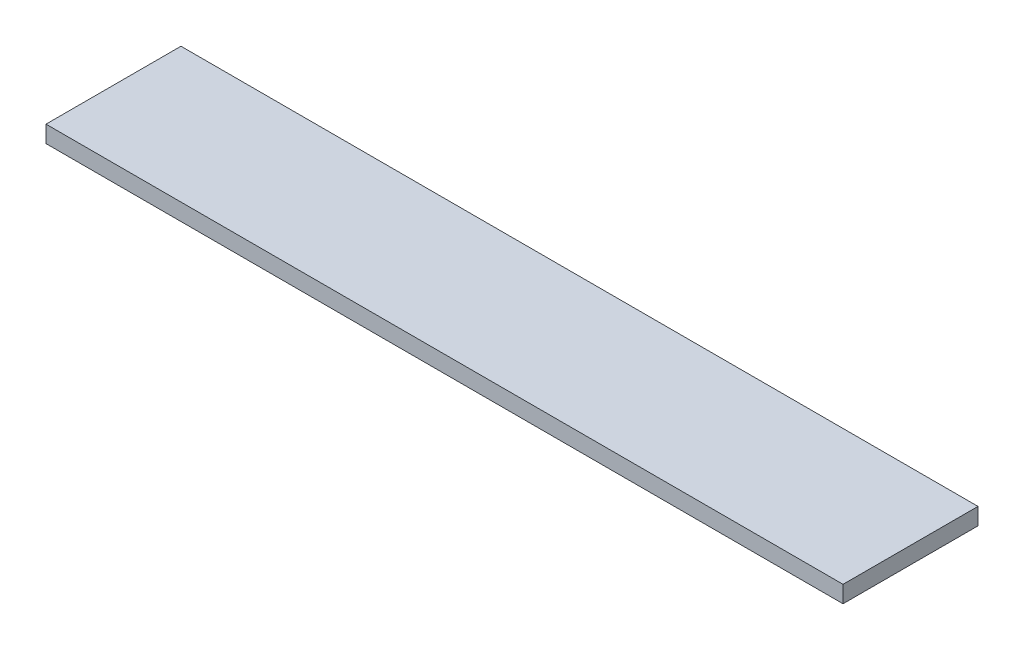
ISO-10303-21;
HEADER;
FILE_DESCRIPTION(('STEP AP214'),'2;1');
FILE_NAME('part.step','',(''),(''),'','','');
FILE_SCHEMA(('AUTOMOTIVE_DESIGN { 1 0 10303 214 1 1 1 1 }'));
ENDSEC;
DATA;
#1=APPLICATION_CONTEXT('core data for automotive mechanical design processes');
#2=APPLICATION_PROTOCOL_DEFINITION('international standard','automotive_design',2000,#1);
#3=PRODUCT_CONTEXT('',#1,'mechanical');
#4=PRODUCT('Part','Part','',(#3));
#5=PRODUCT_RELATED_PRODUCT_CATEGORY('part','',(#4));
#6=PRODUCT_DEFINITION_FORMATION('','',#4);
#7=PRODUCT_DEFINITION_CONTEXT('part definition',#1,'design');
#8=PRODUCT_DEFINITION('design','',#6,#7);
#9=PRODUCT_DEFINITION_SHAPE('','',#8);
#10=(LENGTH_UNIT() NAMED_UNIT(*) SI_UNIT(.MILLI.,.METRE.));
#11=(NAMED_UNIT(*) PLANE_ANGLE_UNIT() SI_UNIT($,.RADIAN.));
#12=(NAMED_UNIT(*) SI_UNIT($,.STERADIAN.) SOLID_ANGLE_UNIT());
#13=UNCERTAINTY_MEASURE_WITH_UNIT(LENGTH_MEASURE(1.E-05),#10,'distance_accuracy_value','');
#14=(GEOMETRIC_REPRESENTATION_CONTEXT(3) GLOBAL_UNCERTAINTY_ASSIGNED_CONTEXT((#13)) GLOBAL_UNIT_ASSIGNED_CONTEXT((#10,
#11,#12)) REPRESENTATION_CONTEXT('',''));
#15=CARTESIAN_POINT('',(0.,0.,0.));
#16=DIRECTION('',(0.,0.,1.));
#17=DIRECTION('',(1.,0.,0.));
#18=AXIS2_PLACEMENT_3D('',#15,#16,#17);
#19=CARTESIAN_POINT('',(600.,0.,0.));
#20=DIRECTION('',(0.,0.,-1.));
#21=DIRECTION('',(-1.,0.,0.));
#22=AXIS2_PLACEMENT_3D('',#19,#20,#21);
#23=PLANE('',#22);
#24=DIRECTION('',(0.,-1.,0.));
#25=VECTOR('',#24,1.);
#26=CARTESIAN_POINT('',(0.,0.,0.));
#27=LINE('',#26,#25);
#28=CARTESIAN_POINT('',(0.,12.7,0.));
#29=VERTEX_POINT('',#28);
#30=CARTESIAN_POINT('',(0.,0.,0.));
#31=VERTEX_POINT('',#30);
#32=EDGE_CURVE('E96',#29,#31,#27,.T.);
#33=ORIENTED_EDGE('',*,*,#32,.T.);
#34=DIRECTION('',(-1.,0.,0.));
#35=VECTOR('',#34,1.);
#36=CARTESIAN_POINT('',(600.,0.,0.));
#37=LINE('',#36,#35);
#38=CARTESIAN_POINT('',(600.,0.,0.));
#39=VERTEX_POINT('',#38);
#40=EDGE_CURVE('E11',#39,#31,#37,.T.);
#41=ORIENTED_EDGE('',*,*,#40,.F.);
#42=DIRECTION('',(0.,-1.,0.));
#43=VECTOR('',#42,1.);
#44=CARTESIAN_POINT('',(600.,0.,0.));
#45=LINE('',#44,#43);
#46=CARTESIAN_POINT('',(600.,12.7,0.));
#47=VERTEX_POINT('',#46);
#48=EDGE_CURVE('E84',#47,#39,#45,.T.);
#49=ORIENTED_EDGE('',*,*,#48,.F.);
#50=DIRECTION('',(-1.,0.,0.));
#51=VECTOR('',#50,1.);
#52=CARTESIAN_POINT('',(600.,12.7,0.));
#53=LINE('',#52,#51);
#54=EDGE_CURVE('E92',#47,#29,#53,.T.);
#55=ORIENTED_EDGE('',*,*,#54,.T.);
#56=EDGE_LOOP('',(#33,#41,#49,#55));
#57=FACE_BOUND('',#56,.T.);
#58=ADVANCED_FACE('F33',(#57),#23,.F.);
#59=CARTESIAN_POINT('',(600.,0.,0.));
#60=DIRECTION('',(0.,1.,0.));
#61=DIRECTION('',(0.,0.,1.));
#62=AXIS2_PLACEMENT_3D('',#59,#60,#61);
#63=PLANE('',#62);
#64=DIRECTION('',(0.,0.,-1.));
#65=VECTOR('',#64,1.);
#66=CARTESIAN_POINT('',(0.,0.,0.));
#67=LINE('',#66,#65);
#68=CARTESIAN_POINT('',(0.,0.,-101.6));
#69=VERTEX_POINT('',#68);
#70=EDGE_CURVE('E88',#31,#69,#67,.T.);
#71=ORIENTED_EDGE('',*,*,#70,.T.);
#72=DIRECTION('',(-1.,0.,0.));
#73=VECTOR('',#72,1.);
#74=CARTESIAN_POINT('',(600.,0.,-101.6));
#75=LINE('',#74,#73);
#76=CARTESIAN_POINT('',(600.,0.,-101.6));
#77=VERTEX_POINT('',#76);
#78=EDGE_CURVE('E41',#77,#69,#75,.T.);
#79=ORIENTED_EDGE('',*,*,#78,.F.);
#80=DIRECTION('',(0.,0.,-1.));
#81=VECTOR('',#80,1.);
#82=CARTESIAN_POINT('',(600.,0.,0.));
#83=LINE('',#82,#81);
#84=EDGE_CURVE('E79',#39,#77,#83,.T.);
#85=ORIENTED_EDGE('',*,*,#84,.F.);
#86=ORIENTED_EDGE('',*,*,#40,.T.);
#87=EDGE_LOOP('',(#71,#79,#85,#86));
#88=FACE_BOUND('',#87,.T.);
#89=ADVANCED_FACE('F87',(#88),#63,.F.);
#90=CARTESIAN_POINT('',(600.,0.,-101.6));
#91=DIRECTION('',(0.,0.,1.));
#92=DIRECTION('',(1.,0.,0.));
#93=AXIS2_PLACEMENT_3D('',#90,#91,#92);
#94=PLANE('',#93);
#95=DIRECTION('',(0.,1.,0.));
#96=VECTOR('',#95,1.);
#97=CARTESIAN_POINT('',(0.,0.,-101.6));
#98=LINE('',#97,#96);
#99=CARTESIAN_POINT('',(0.,12.7,-101.6));
#100=VERTEX_POINT('',#99);
#101=EDGE_CURVE('E66',#69,#100,#98,.T.);
#102=ORIENTED_EDGE('',*,*,#101,.T.);
#103=DIRECTION('',(-1.,0.,0.));
#104=VECTOR('',#103,1.);
#105=CARTESIAN_POINT('',(600.,12.7,-101.6));
#106=LINE('',#105,#104);
#107=CARTESIAN_POINT('',(600.,12.7,-101.6));
#108=VERTEX_POINT('',#107);
#109=EDGE_CURVE('E89',#108,#100,#106,.T.);
#110=ORIENTED_EDGE('',*,*,#109,.F.);
#111=DIRECTION('',(0.,1.,0.));
#112=VECTOR('',#111,1.);
#113=CARTESIAN_POINT('',(600.,0.,-101.6));
#114=LINE('',#113,#112);
#115=EDGE_CURVE('E82',#77,#108,#114,.T.);
#116=ORIENTED_EDGE('',*,*,#115,.F.);
#117=ORIENTED_EDGE('',*,*,#78,.T.);
#118=EDGE_LOOP('',(#102,#110,#116,#117));
#119=FACE_BOUND('',#118,.T.);
#120=ADVANCED_FACE('F90',(#119),#94,.F.);
#121=CARTESIAN_POINT('',(600.,12.7,0.));
#122=DIRECTION('',(0.,-1.,0.));
#123=DIRECTION('',(0.,0.,-1.));
#124=AXIS2_PLACEMENT_3D('',#121,#122,#123);
#125=PLANE('',#124);
#126=DIRECTION('',(0.,0.,1.));
#127=VECTOR('',#126,1.);
#128=CARTESIAN_POINT('',(0.,12.7,0.));
#129=LINE('',#128,#127);
#130=EDGE_CURVE('E72',#100,#29,#129,.T.);
#131=ORIENTED_EDGE('',*,*,#130,.T.);
#132=ORIENTED_EDGE('',*,*,#54,.F.);
#133=DIRECTION('',(0.,0.,1.));
#134=VECTOR('',#133,1.);
#135=CARTESIAN_POINT('',(600.,12.7,0.));
#136=LINE('',#135,#134);
#137=EDGE_CURVE('E49',#108,#47,#136,.T.);
#138=ORIENTED_EDGE('',*,*,#137,.F.);
#139=ORIENTED_EDGE('',*,*,#109,.T.);
#140=EDGE_LOOP('',(#131,#132,#138,#139));
#141=FACE_BOUND('',#140,.T.);
#142=ADVANCED_FACE('F103',(#141),#125,.F.);
#143=CARTESIAN_POINT('',(600.,0.,0.));
#144=DIRECTION('',(-1.,0.,0.));
#145=DIRECTION('',(0.,0.,1.));
#146=AXIS2_PLACEMENT_3D('',#143,#144,#145);
#147=PLANE('',#146);
#148=ORIENTED_EDGE('',*,*,#48,.T.);
#149=ORIENTED_EDGE('',*,*,#84,.T.);
#150=ORIENTED_EDGE('',*,*,#115,.T.);
#151=ORIENTED_EDGE('',*,*,#137,.T.);
#152=EDGE_LOOP('',(#148,#149,#150,#151));
#153=FACE_BOUND('',#152,.T.);
#154=ADVANCED_FACE('F80',(#153),#147,.F.);
#155=CARTESIAN_POINT('',(0.,0.,0.));
#156=DIRECTION('',(-1.,0.,0.));
#157=DIRECTION('',(0.,0.,1.));
#158=AXIS2_PLACEMENT_3D('',#155,#156,#157);
#159=PLANE('',#158);
#160=ORIENTED_EDGE('',*,*,#32,.F.);
#161=ORIENTED_EDGE('',*,*,#130,.F.);
#162=ORIENTED_EDGE('',*,*,#101,.F.);
#163=ORIENTED_EDGE('',*,*,#70,.F.);
#164=EDGE_LOOP('',(#160,#161,#162,#163));
#165=FACE_BOUND('',#164,.T.);
#166=ADVANCED_FACE('F106',(#165),#159,.T.);
#167=CLOSED_SHELL('',(#58,#89,#120,#142,#154,#166));
#168=MANIFOLD_SOLID_BREP('B2',#167);
#169=ADVANCED_BREP_SHAPE_REPRESENTATION('',(#18,#168),#14);
#170=SHAPE_DEFINITION_REPRESENTATION(#9,#169);
ENDSEC;
END-ISO-10303-21;
